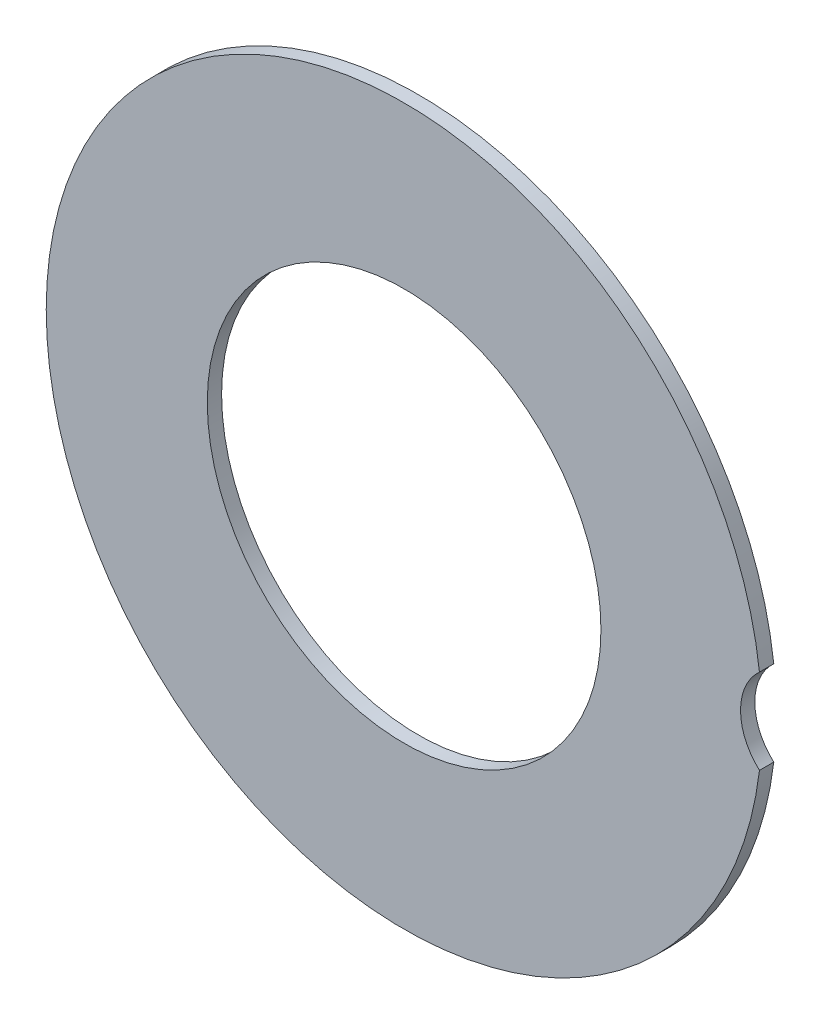
ISO-10303-21;
HEADER;
FILE_DESCRIPTION(('STEP AP214'),'2;1');
FILE_NAME('part.step','',(''),(''),'','','');
FILE_SCHEMA(('AUTOMOTIVE_DESIGN { 1 0 10303 214 1 1 1 1 }'));
ENDSEC;
DATA;
#1=APPLICATION_CONTEXT('core data for automotive mechanical design processes');
#2=APPLICATION_PROTOCOL_DEFINITION('international standard','automotive_design',2000,#1);
#3=PRODUCT_CONTEXT('',#1,'mechanical');
#4=PRODUCT('Part','Part','',(#3));
#5=PRODUCT_RELATED_PRODUCT_CATEGORY('part','',(#4));
#6=PRODUCT_DEFINITION_FORMATION('','',#4);
#7=PRODUCT_DEFINITION_CONTEXT('part definition',#1,'design');
#8=PRODUCT_DEFINITION('design','',#6,#7);
#9=PRODUCT_DEFINITION_SHAPE('','',#8);
#10=(LENGTH_UNIT() NAMED_UNIT(*) SI_UNIT(.MILLI.,.METRE.));
#11=(NAMED_UNIT(*) PLANE_ANGLE_UNIT() SI_UNIT($,.RADIAN.));
#12=(NAMED_UNIT(*) SI_UNIT($,.STERADIAN.) SOLID_ANGLE_UNIT());
#13=UNCERTAINTY_MEASURE_WITH_UNIT(LENGTH_MEASURE(1.E-05),#10,'distance_accuracy_value','');
#14=(GEOMETRIC_REPRESENTATION_CONTEXT(3) GLOBAL_UNCERTAINTY_ASSIGNED_CONTEXT((#13)) GLOBAL_UNIT_ASSIGNED_CONTEXT((#10,
#11,#12)) REPRESENTATION_CONTEXT('',''));
#15=CARTESIAN_POINT('',(0.,0.,0.));
#16=DIRECTION('',(0.,0.,1.));
#17=DIRECTION('',(1.,0.,0.));
#18=AXIS2_PLACEMENT_3D('',#15,#16,#17);
#19=CARTESIAN_POINT('',(0.,0.,0.));
#20=DIRECTION('',(0.,0.,1.));
#21=DIRECTION('',(1.,0.,0.));
#22=AXIS2_PLACEMENT_3D('',#19,#20,#21);
#23=PLANE('',#22);
#24=CARTESIAN_POINT('',(0.,0.,0.));
#25=DIRECTION('',(0.,0.,1.));
#26=DIRECTION('',(1.,0.,0.));
#27=AXIS2_PLACEMENT_3D('',#24,#25,#26);
#28=CIRCLE('',#27,55.);
#29=CARTESIAN_POINT('',(55.,0.,0.));
#30=VERTEX_POINT('',#29);
#31=EDGE_CURVE('E86',#30,#30,#28,.T.);
#32=ORIENTED_EDGE('',*,*,#31,.T.);
#33=EDGE_LOOP('',(#32));
#34=FACE_BOUND('',#33,.T.);
#35=CARTESIAN_POINT('',(0.,0.,0.));
#36=DIRECTION('',(0.,0.,1.));
#37=DIRECTION('',(1.,0.,0.));
#38=AXIS2_PLACEMENT_3D('',#35,#36,#37);
#39=CIRCLE('',#38,100.);
#40=CARTESIAN_POINT('',(99.2909090909091,11.8876142224093,0.));
#41=VERTEX_POINT('',#40);
#42=CARTESIAN_POINT('',(99.2909090909091,-11.8876142224093,0.));
#43=VERTEX_POINT('',#42);
#44=EDGE_CURVE('E80',#41,#43,#39,.T.);
#45=ORIENTED_EDGE('',*,*,#44,.F.);
#46=CARTESIAN_POINT('',(110.,0.,0.));
#47=DIRECTION('',(0.,0.,1.));
#48=DIRECTION('',(1.,0.,0.));
#49=AXIS2_PLACEMENT_3D('',#46,#47,#48);
#50=CIRCLE('',#49,16.);
#51=EDGE_CURVE('E58',#41,#43,#50,.T.);
#52=ORIENTED_EDGE('',*,*,#51,.T.);
#53=EDGE_LOOP('',(#45,#52));
#54=FACE_BOUND('',#53,.T.);
#55=ADVANCED_FACE('F44',(#34,#54),#23,.F.);
#56=CARTESIAN_POINT('',(0.,0.,4.));
#57=DIRECTION('',(0.,0.,-1.));
#58=DIRECTION('',(-1.,0.,0.));
#59=AXIS2_PLACEMENT_3D('',#56,#57,#58);
#60=CYLINDRICAL_SURFACE('',#59,100.);
#61=DIRECTION('',(0.,0.,-1.));
#62=VECTOR('',#61,1.);
#63=CARTESIAN_POINT('',(99.2909090909091,-11.8876142224093,2.5));
#64=LINE('',#63,#62);
#65=CARTESIAN_POINT('',(99.2909090909091,-11.8876142224093,4.));
#66=VERTEX_POINT('',#65);
#67=EDGE_CURVE('E11',#66,#43,#64,.T.);
#68=ORIENTED_EDGE('',*,*,#67,.F.);
#69=CARTESIAN_POINT('',(0.,0.,4.));
#70=DIRECTION('',(0.,0.,1.));
#71=DIRECTION('',(1.,0.,0.));
#72=AXIS2_PLACEMENT_3D('',#69,#70,#71);
#73=CIRCLE('',#72,100.);
#74=CARTESIAN_POINT('',(99.2909090909091,11.8876142224092,4.));
#75=VERTEX_POINT('',#74);
#76=EDGE_CURVE('E81',#75,#66,#73,.T.);
#77=ORIENTED_EDGE('',*,*,#76,.F.);
#78=DIRECTION('',(0.,0.,-1.));
#79=VECTOR('',#78,1.);
#80=CARTESIAN_POINT('',(99.2909090909091,11.8876142224093,2.5));
#81=LINE('',#80,#79);
#82=EDGE_CURVE('E53',#41,#75,#81,.F.);
#83=ORIENTED_EDGE('',*,*,#82,.F.);
#84=ORIENTED_EDGE('',*,*,#44,.T.);
#85=EDGE_LOOP('',(#68,#77,#83,#84));
#86=FACE_BOUND('',#85,.T.);
#87=ADVANCED_FACE('F50',(#86),#60,.T.);
#88=CARTESIAN_POINT('',(0.,0.,4.));
#89=DIRECTION('',(0.,0.,1.));
#90=DIRECTION('',(1.,0.,0.));
#91=AXIS2_PLACEMENT_3D('',#88,#89,#90);
#92=PLANE('',#91);
#93=ORIENTED_EDGE('',*,*,#76,.T.);
#94=CARTESIAN_POINT('',(110.,0.,4.));
#95=DIRECTION('',(0.,0.,1.));
#96=DIRECTION('',(1.,0.,0.));
#97=AXIS2_PLACEMENT_3D('',#94,#95,#96);
#98=CIRCLE('',#97,16.);
#99=EDGE_CURVE('E63',#66,#75,#98,.F.);
#100=ORIENTED_EDGE('',*,*,#99,.T.);
#101=EDGE_LOOP('',(#93,#100));
#102=FACE_BOUND('',#101,.T.);
#103=CARTESIAN_POINT('',(0.,0.,4.));
#104=DIRECTION('',(0.,0.,1.));
#105=DIRECTION('',(1.,0.,0.));
#106=AXIS2_PLACEMENT_3D('',#103,#104,#105);
#107=CIRCLE('',#106,55.);
#108=CARTESIAN_POINT('',(55.,0.,4.));
#109=VERTEX_POINT('',#108);
#110=EDGE_CURVE('E85',#109,#109,#107,.T.);
#111=ORIENTED_EDGE('',*,*,#110,.F.);
#112=EDGE_LOOP('',(#111));
#113=FACE_BOUND('',#112,.T.);
#114=ADVANCED_FACE('F91',(#102,#113),#92,.T.);
#115=CARTESIAN_POINT('',(0.,0.,4.));
#116=DIRECTION('',(0.,0.,-1.));
#117=DIRECTION('',(-1.,0.,0.));
#118=AXIS2_PLACEMENT_3D('',#115,#116,#117);
#119=CYLINDRICAL_SURFACE('',#118,55.);
#120=ORIENTED_EDGE('',*,*,#110,.T.);
#121=EDGE_LOOP('',(#120));
#122=FACE_BOUND('',#121,.T.);
#123=ORIENTED_EDGE('',*,*,#31,.F.);
#124=EDGE_LOOP('',(#123));
#125=FACE_BOUND('',#124,.T.);
#126=ADVANCED_FACE('F105',(#122,#125),#119,.F.);
#127=CARTESIAN_POINT('',(110.,0.,5.));
#128=DIRECTION('',(0.,0.,-1.));
#129=DIRECTION('',(-1.,0.,0.));
#130=AXIS2_PLACEMENT_3D('',#127,#128,#129);
#131=CYLINDRICAL_SURFACE('',#130,16.);
#132=ORIENTED_EDGE('',*,*,#67,.T.);
#133=ORIENTED_EDGE('',*,*,#51,.F.);
#134=ORIENTED_EDGE('',*,*,#82,.T.);
#135=ORIENTED_EDGE('',*,*,#99,.F.);
#136=EDGE_LOOP('',(#132,#133,#134,#135));
#137=FACE_BOUND('',#136,.T.);
#138=ADVANCED_FACE('F69',(#137),#131,.F.);
#139=CLOSED_SHELL('',(#55,#87,#114,#126,#138));
#140=MANIFOLD_SOLID_BREP('B2',#139);
#141=ADVANCED_BREP_SHAPE_REPRESENTATION('',(#18,#140),#14);
#142=SHAPE_DEFINITION_REPRESENTATION(#9,#141);
ENDSEC;
END-ISO-10303-21;
